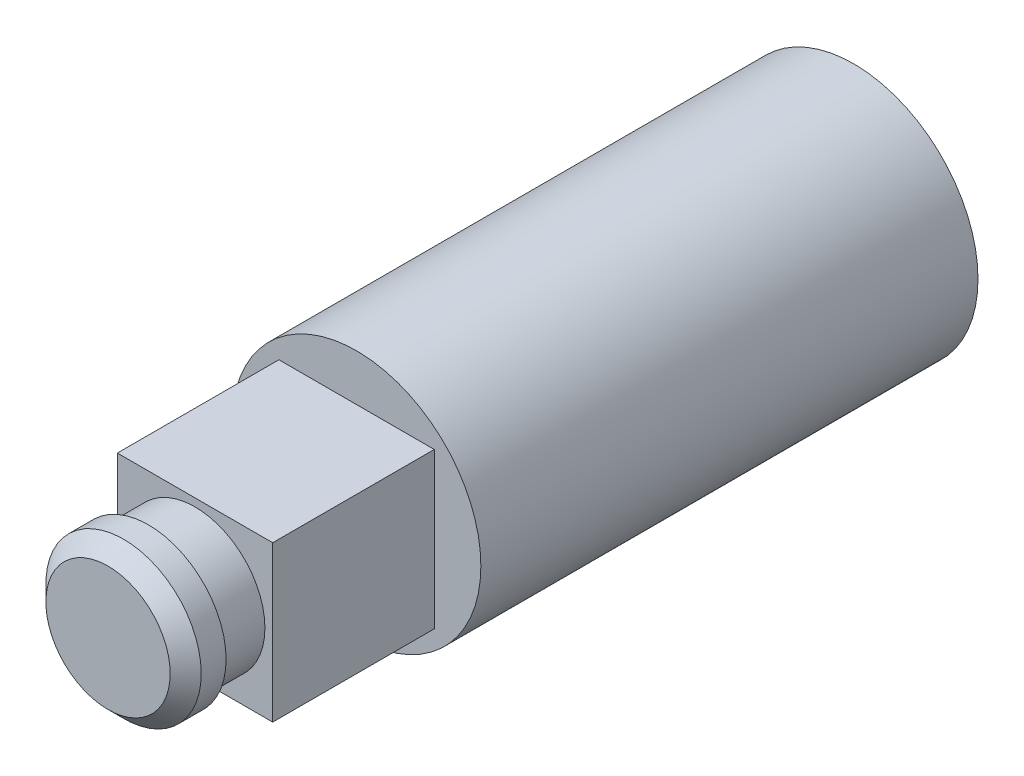
ISO-10303-21;
HEADER;
FILE_DESCRIPTION(('STEP AP214'),'2;1');
FILE_NAME('part.step','',(''),(''),'','','');
FILE_SCHEMA(('AUTOMOTIVE_DESIGN { 1 0 10303 214 1 1 1 1 }'));
ENDSEC;
DATA;
#1=APPLICATION_CONTEXT('core data for automotive mechanical design processes');
#2=APPLICATION_PROTOCOL_DEFINITION('international standard','automotive_design',2000,#1);
#3=PRODUCT_CONTEXT('',#1,'mechanical');
#4=PRODUCT('Part','Part','',(#3));
#5=PRODUCT_RELATED_PRODUCT_CATEGORY('part','',(#4));
#6=PRODUCT_DEFINITION_FORMATION('','',#4);
#7=PRODUCT_DEFINITION_CONTEXT('part definition',#1,'design');
#8=PRODUCT_DEFINITION('design','',#6,#7);
#9=PRODUCT_DEFINITION_SHAPE('','',#8);
#10=(LENGTH_UNIT() NAMED_UNIT(*) SI_UNIT(.MILLI.,.METRE.));
#11=(NAMED_UNIT(*) PLANE_ANGLE_UNIT() SI_UNIT($,.RADIAN.));
#12=(NAMED_UNIT(*) SI_UNIT($,.STERADIAN.) SOLID_ANGLE_UNIT());
#13=UNCERTAINTY_MEASURE_WITH_UNIT(LENGTH_MEASURE(1.E-05),#10,'distance_accuracy_value','');
#14=(GEOMETRIC_REPRESENTATION_CONTEXT(3) GLOBAL_UNCERTAINTY_ASSIGNED_CONTEXT((#13)) GLOBAL_UNIT_ASSIGNED_CONTEXT((#10,
#11,#12)) REPRESENTATION_CONTEXT('',''));
#15=CARTESIAN_POINT('',(0.,0.,0.));
#16=DIRECTION('',(0.,0.,1.));
#17=DIRECTION('',(1.,0.,0.));
#18=AXIS2_PLACEMENT_3D('',#15,#16,#17);
#19=CARTESIAN_POINT('',(0.,0.,8.));
#20=DIRECTION('',(0.,0.,-1.));
#21=DIRECTION('',(-1.,0.,0.));
#22=AXIS2_PLACEMENT_3D('',#19,#20,#21);
#23=CYLINDRICAL_SURFACE('',#22,4.);
#24=CARTESIAN_POINT('',(0.,0.,8.));
#25=DIRECTION('',(0.,0.,1.));
#26=DIRECTION('',(1.,0.,0.));
#27=AXIS2_PLACEMENT_3D('',#24,#25,#26);
#28=CIRCLE('',#27,4.);
#29=CARTESIAN_POINT('',(4.,0.,8.));
#30=VERTEX_POINT('',#29);
#31=EDGE_CURVE('E125',#30,#30,#28,.T.);
#32=ORIENTED_EDGE('',*,*,#31,.F.);
#33=EDGE_LOOP('',(#32));
#34=FACE_BOUND('',#33,.T.);
#35=CARTESIAN_POINT('',(0.,0.,-8.));
#36=DIRECTION('',(0.,0.,1.));
#37=DIRECTION('',(1.,0.,0.));
#38=AXIS2_PLACEMENT_3D('',#35,#36,#37);
#39=CIRCLE('',#38,4.);
#40=CARTESIAN_POINT('',(4.,0.,-8.));
#41=VERTEX_POINT('',#40);
#42=EDGE_CURVE('E116',#41,#41,#39,.T.);
#43=ORIENTED_EDGE('',*,*,#42,.T.);
#44=EDGE_LOOP('',(#43));
#45=FACE_BOUND('',#44,.T.);
#46=ADVANCED_FACE('F49',(#34,#45),#23,.T.);
#47=CARTESIAN_POINT('',(0.,0.,8.));
#48=DIRECTION('',(0.,0.,1.));
#49=DIRECTION('',(1.,0.,0.));
#50=AXIS2_PLACEMENT_3D('',#47,#48,#49);
#51=PLANE('',#50);
#52=DIRECTION('',(0.,1.,0.));
#53=VECTOR('',#52,1.);
#54=CARTESIAN_POINT('',(2.5,-2.5,8.));
#55=LINE('',#54,#53);
#56=CARTESIAN_POINT('',(2.5,-2.5,8.));
#57=VERTEX_POINT('',#56);
#58=CARTESIAN_POINT('',(2.5,2.5,8.));
#59=VERTEX_POINT('',#58);
#60=EDGE_CURVE('E70',#57,#59,#55,.T.);
#61=ORIENTED_EDGE('',*,*,#60,.F.);
#62=DIRECTION('',(1.,0.,0.));
#63=VECTOR('',#62,1.);
#64=CARTESIAN_POINT('',(-2.5,-2.5,8.));
#65=LINE('',#64,#63);
#66=CARTESIAN_POINT('',(-2.5,-2.5,8.));
#67=VERTEX_POINT('',#66);
#68=EDGE_CURVE('E72',#67,#57,#65,.T.);
#69=ORIENTED_EDGE('',*,*,#68,.F.);
#70=DIRECTION('',(0.,-1.,0.));
#71=VECTOR('',#70,1.);
#72=CARTESIAN_POINT('',(-2.5,-2.5,8.));
#73=LINE('',#72,#71);
#74=CARTESIAN_POINT('',(-2.5,2.5,8.));
#75=VERTEX_POINT('',#74);
#76=EDGE_CURVE('E209',#75,#67,#73,.T.);
#77=ORIENTED_EDGE('',*,*,#76,.F.);
#78=DIRECTION('',(-1.,0.,0.));
#79=VECTOR('',#78,1.);
#80=CARTESIAN_POINT('',(-2.5,2.5,8.));
#81=LINE('',#80,#79);
#82=EDGE_CURVE('E210',#59,#75,#81,.T.);
#83=ORIENTED_EDGE('',*,*,#82,.F.);
#84=EDGE_LOOP('',(#61,#69,#77,#83));
#85=FACE_BOUND('',#84,.T.);
#86=ORIENTED_EDGE('',*,*,#31,.T.);
#87=EDGE_LOOP('',(#86));
#88=FACE_BOUND('',#87,.T.);
#89=ADVANCED_FACE('F151',(#85,#88),#51,.T.);
#90=CARTESIAN_POINT('',(0.,0.,-8.));
#91=DIRECTION('',(0.,0.,1.));
#92=DIRECTION('',(1.,0.,0.));
#93=AXIS2_PLACEMENT_3D('',#90,#91,#92);
#94=PLANE('',#93);
#95=ORIENTED_EDGE('',*,*,#42,.F.);
#96=EDGE_LOOP('',(#95));
#97=FACE_BOUND('',#96,.T.);
#98=ADVANCED_FACE('F160',(#97),#94,.F.);
#99=CARTESIAN_POINT('',(2.5,-2.5,13.2));
#100=DIRECTION('',(-1.,0.,0.));
#101=DIRECTION('',(0.,-1.,0.));
#102=AXIS2_PLACEMENT_3D('',#99,#100,#101);
#103=PLANE('',#102);
#104=ORIENTED_EDGE('',*,*,#60,.T.);
#105=DIRECTION('',(0.,0.,-1.));
#106=VECTOR('',#105,1.);
#107=CARTESIAN_POINT('',(2.5,2.5,13.2));
#108=LINE('',#107,#106);
#109=CARTESIAN_POINT('',(2.5,2.5,13.2));
#110=VERTEX_POINT('',#109);
#111=EDGE_CURVE('E107',#110,#59,#108,.T.);
#112=ORIENTED_EDGE('',*,*,#111,.F.);
#113=DIRECTION('',(0.,1.,0.));
#114=VECTOR('',#113,1.);
#115=CARTESIAN_POINT('',(2.5,-2.5,13.2));
#116=LINE('',#115,#114);
#117=CARTESIAN_POINT('',(2.5,-2.5,13.2));
#118=VERTEX_POINT('',#117);
#119=EDGE_CURVE('E89',#118,#110,#116,.T.);
#120=ORIENTED_EDGE('',*,*,#119,.F.);
#121=DIRECTION('',(0.,0.,-1.));
#122=VECTOR('',#121,1.);
#123=CARTESIAN_POINT('',(2.5,-2.5,13.2));
#124=LINE('',#123,#122);
#125=EDGE_CURVE('E204',#118,#57,#124,.T.);
#126=ORIENTED_EDGE('',*,*,#125,.T.);
#127=EDGE_LOOP('',(#104,#112,#120,#126));
#128=FACE_BOUND('',#127,.T.);
#129=ADVANCED_FACE('F113',(#128),#103,.F.);
#130=CARTESIAN_POINT('',(-2.5,2.5,13.2));
#131=DIRECTION('',(0.,-1.,0.));
#132=DIRECTION('',(1.,0.,0.));
#133=AXIS2_PLACEMENT_3D('',#130,#131,#132);
#134=PLANE('',#133);
#135=ORIENTED_EDGE('',*,*,#82,.T.);
#136=DIRECTION('',(0.,0.,-1.));
#137=VECTOR('',#136,1.);
#138=CARTESIAN_POINT('',(-2.5,2.5,13.2));
#139=LINE('',#138,#137);
#140=CARTESIAN_POINT('',(-2.5,2.5,13.2));
#141=VERTEX_POINT('',#140);
#142=EDGE_CURVE('E109',#141,#75,#139,.T.);
#143=ORIENTED_EDGE('',*,*,#142,.F.);
#144=DIRECTION('',(-1.,0.,0.));
#145=VECTOR('',#144,1.);
#146=CARTESIAN_POINT('',(-2.5,2.5,13.2));
#147=LINE('',#146,#145);
#148=EDGE_CURVE('E94',#110,#141,#147,.T.);
#149=ORIENTED_EDGE('',*,*,#148,.F.);
#150=ORIENTED_EDGE('',*,*,#111,.T.);
#151=EDGE_LOOP('',(#135,#143,#149,#150));
#152=FACE_BOUND('',#151,.T.);
#153=ADVANCED_FACE('F110',(#152),#134,.F.);
#154=CARTESIAN_POINT('',(-2.5,-2.5,13.2));
#155=DIRECTION('',(1.,0.,0.));
#156=DIRECTION('',(0.,0.,-1.));
#157=AXIS2_PLACEMENT_3D('',#154,#155,#156);
#158=PLANE('',#157);
#159=ORIENTED_EDGE('',*,*,#76,.T.);
#160=DIRECTION('',(0.,0.,-1.));
#161=VECTOR('',#160,1.);
#162=CARTESIAN_POINT('',(-2.5,-2.5,13.2));
#163=LINE('',#162,#161);
#164=CARTESIAN_POINT('',(-2.5,-2.5,13.2));
#165=VERTEX_POINT('',#164);
#166=EDGE_CURVE('E124',#165,#67,#163,.T.);
#167=ORIENTED_EDGE('',*,*,#166,.F.);
#168=DIRECTION('',(0.,-1.,0.));
#169=VECTOR('',#168,1.);
#170=CARTESIAN_POINT('',(-2.5,-2.5,13.2));
#171=LINE('',#170,#169);
#172=EDGE_CURVE('E114',#141,#165,#171,.T.);
#173=ORIENTED_EDGE('',*,*,#172,.F.);
#174=ORIENTED_EDGE('',*,*,#142,.T.);
#175=EDGE_LOOP('',(#159,#167,#173,#174));
#176=FACE_BOUND('',#175,.T.);
#177=ADVANCED_FACE('F169',(#176),#158,.F.);
#178=CARTESIAN_POINT('',(-2.5,-2.5,13.2));
#179=DIRECTION('',(0.,1.,0.));
#180=DIRECTION('',(0.,0.,1.));
#181=AXIS2_PLACEMENT_3D('',#178,#179,#180);
#182=PLANE('',#181);
#183=ORIENTED_EDGE('',*,*,#68,.T.);
#184=ORIENTED_EDGE('',*,*,#125,.F.);
#185=DIRECTION('',(1.,0.,0.));
#186=VECTOR('',#185,1.);
#187=CARTESIAN_POINT('',(-2.5,-2.5,13.2));
#188=LINE('',#187,#186);
#189=EDGE_CURVE('E100',#165,#118,#188,.T.);
#190=ORIENTED_EDGE('',*,*,#189,.F.);
#191=ORIENTED_EDGE('',*,*,#166,.T.);
#192=EDGE_LOOP('',(#183,#184,#190,#191));
#193=FACE_BOUND('',#192,.T.);
#194=ADVANCED_FACE('F174',(#193),#182,.F.);
#195=CARTESIAN_POINT('',(0.,0.,13.2));
#196=DIRECTION('',(0.,0.,-1.));
#197=DIRECTION('',(-1.,0.,0.));
#198=AXIS2_PLACEMENT_3D('',#195,#196,#197);
#199=PLANE('',#198);
#200=ORIENTED_EDGE('',*,*,#119,.T.);
#201=ORIENTED_EDGE('',*,*,#148,.T.);
#202=ORIENTED_EDGE('',*,*,#172,.T.);
#203=ORIENTED_EDGE('',*,*,#189,.T.);
#204=EDGE_LOOP('',(#200,#201,#202,#203));
#205=FACE_BOUND('',#204,.T.);
#206=CARTESIAN_POINT('',(0.,0.,13.2));
#207=DIRECTION('',(0.,0.,1.));
#208=DIRECTION('',(1.,0.,0.));
#209=AXIS2_PLACEMENT_3D('',#206,#207,#208);
#210=CIRCLE('',#209,2.25);
#211=CARTESIAN_POINT('',(2.25,0.,13.2));
#212=VERTEX_POINT('',#211);
#213=EDGE_CURVE('E194',#212,#212,#210,.T.);
#214=ORIENTED_EDGE('',*,*,#213,.F.);
#215=EDGE_LOOP('',(#214));
#216=FACE_BOUND('',#215,.T.);
#217=ADVANCED_FACE('F95',(#205,#216),#199,.F.);
#218=CARTESIAN_POINT('',(0.,0.,14.7));
#219=DIRECTION('',(0.,0.,1.));
#220=DIRECTION('',(1.,0.,0.));
#221=AXIS2_PLACEMENT_3D('',#218,#219,#220);
#222=PLANE('',#221);
#223=CARTESIAN_POINT('',(0.,0.,14.7));
#224=DIRECTION('',(0.,0.,1.));
#225=DIRECTION('',(1.,0.,0.));
#226=AXIS2_PLACEMENT_3D('',#223,#224,#225);
#227=CIRCLE('',#226,2.25);
#228=CARTESIAN_POINT('',(2.25,0.,14.7));
#229=VERTEX_POINT('',#228);
#230=EDGE_CURVE('E133',#229,#229,#227,.T.);
#231=ORIENTED_EDGE('',*,*,#230,.T.);
#232=EDGE_LOOP('',(#231));
#233=FACE_BOUND('',#232,.T.);
#234=CARTESIAN_POINT('',(0.,0.,14.7));
#235=DIRECTION('',(0.,0.,1.));
#236=DIRECTION('',(1.,0.,0.));
#237=AXIS2_PLACEMENT_3D('',#234,#235,#236);
#238=CIRCLE('',#237,2.5);
#239=CARTESIAN_POINT('',(2.5,0.,14.7));
#240=VERTEX_POINT('',#239);
#241=EDGE_CURVE('E134',#240,#240,#238,.T.);
#242=ORIENTED_EDGE('',*,*,#241,.F.);
#243=EDGE_LOOP('',(#242));
#244=FACE_BOUND('',#243,.T.);
#245=ADVANCED_FACE('F176',(#233,#244),#222,.F.);
#246=CARTESIAN_POINT('',(0.,0.,14.7));
#247=DIRECTION('',(0.,0.,-1.));
#248=DIRECTION('',(-1.,0.,0.));
#249=AXIS2_PLACEMENT_3D('',#246,#247,#248);
#250=CYLINDRICAL_SURFACE('',#249,2.25);
#251=ORIENTED_EDGE('',*,*,#230,.F.);
#252=EDGE_LOOP('',(#251));
#253=FACE_BOUND('',#252,.T.);
#254=ORIENTED_EDGE('',*,*,#213,.T.);
#255=EDGE_LOOP('',(#254));
#256=FACE_BOUND('',#255,.T.);
#257=ADVANCED_FACE('F177',(#253,#256),#250,.T.);
#258=CARTESIAN_POINT('',(0.,0.,16.));
#259=DIRECTION('',(0.,0.,1.));
#260=DIRECTION('',(1.,0.,0.));
#261=AXIS2_PLACEMENT_3D('',#258,#259,#260);
#262=PLANE('',#261);
#263=CARTESIAN_POINT('',(0.,0.,16.));
#264=DIRECTION('',(0.,0.,1.));
#265=DIRECTION('',(1.,0.,0.));
#266=AXIS2_PLACEMENT_3D('',#263,#264,#265);
#267=CIRCLE('',#266,2.);
#268=CARTESIAN_POINT('',(2.,0.,16.));
#269=VERTEX_POINT('',#268);
#270=EDGE_CURVE('E58',#269,#269,#267,.T.);
#271=ORIENTED_EDGE('',*,*,#270,.T.);
#272=EDGE_LOOP('',(#271));
#273=FACE_BOUND('',#272,.T.);
#274=ADVANCED_FACE('F139',(#273),#262,.T.);
#275=CARTESIAN_POINT('',(0.,0.,47.0710678118655));
#276=DIRECTION('',(0.,0.,-1.));
#277=DIRECTION('',(-1.,0.,0.));
#278=AXIS2_PLACEMENT_3D('',#275,#276,#277);
#279=CYLINDRICAL_SURFACE('',#278,2.5);
#280=CARTESIAN_POINT('',(0.,0.,15.5));
#281=DIRECTION('',(0.,0.,1.));
#282=DIRECTION('',(1.,0.,0.));
#283=AXIS2_PLACEMENT_3D('',#280,#281,#282);
#284=CIRCLE('',#283,2.5);
#285=CARTESIAN_POINT('',(2.5,0.,15.5));
#286=VERTEX_POINT('',#285);
#287=EDGE_CURVE('E13',#286,#286,#284,.F.);
#288=ORIENTED_EDGE('',*,*,#287,.T.);
#289=EDGE_LOOP('',(#288));
#290=FACE_BOUND('',#289,.T.);
#291=ORIENTED_EDGE('',*,*,#241,.T.);
#292=EDGE_LOOP('',(#291));
#293=FACE_BOUND('',#292,.T.);
#294=ADVANCED_FACE('F142',(#290,#293),#279,.T.);
#295=CARTESIAN_POINT('',(0.,0.,16.));
#296=DIRECTION('',(0.,0.,-1.));
#297=DIRECTION('',(-1.,0.,0.));
#298=AXIS2_PLACEMENT_3D('',#295,#296,#297);
#299=CONICAL_SURFACE('',#298,2.,0.785398163397447);
#300=ORIENTED_EDGE('',*,*,#287,.F.);
#301=EDGE_LOOP('',(#300));
#302=FACE_BOUND('',#301,.T.);
#303=ORIENTED_EDGE('',*,*,#270,.F.);
#304=EDGE_LOOP('',(#303));
#305=FACE_BOUND('',#304,.T.);
#306=ADVANCED_FACE('F52',(#302,#305),#299,.T.);
#307=CLOSED_SHELL('',(#46,#89,#98,#129,#153,#177,#194,#217,#245,#257,#274,#294,#306));
#308=MANIFOLD_SOLID_BREP('B2',#307);
#309=ADVANCED_BREP_SHAPE_REPRESENTATION('',(#18,#308),#14);
#310=SHAPE_DEFINITION_REPRESENTATION(#9,#309);
ENDSEC;
END-ISO-10303-21;
